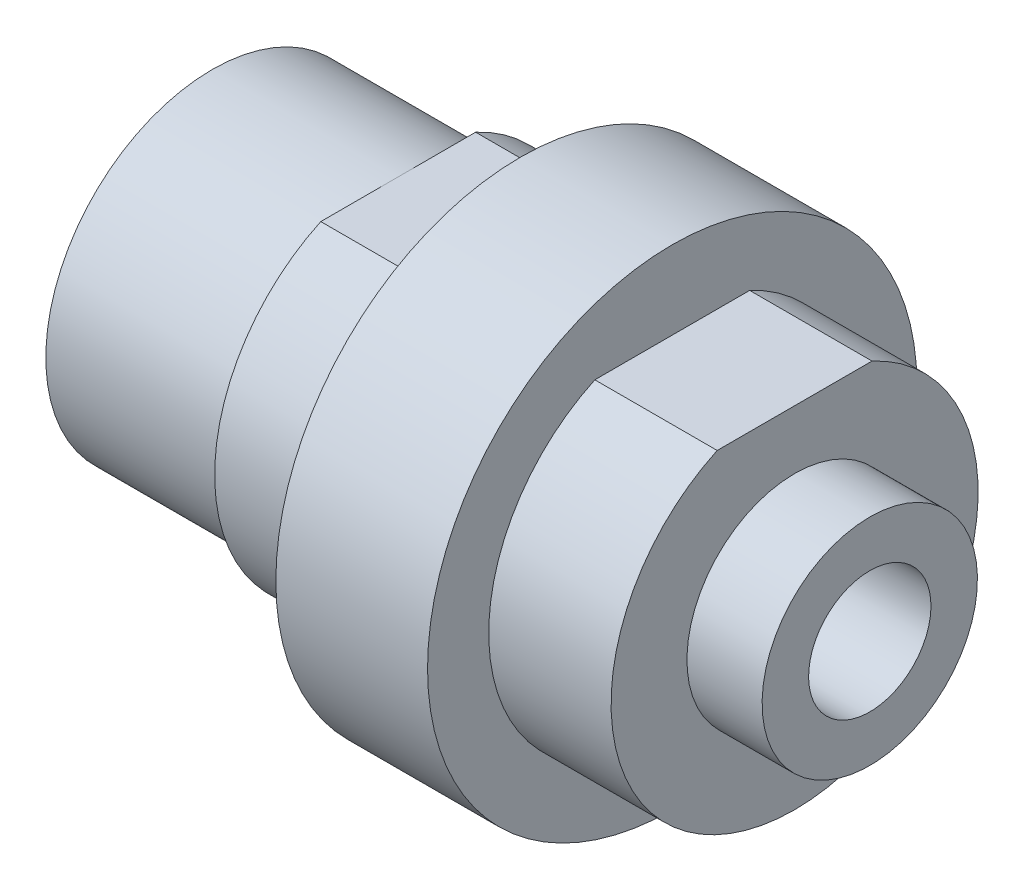
ISO-10303-21;
HEADER;
FILE_DESCRIPTION(('STEP AP214'),'2;1');
FILE_NAME('part.step','',(''),(''),'','','');
FILE_SCHEMA(('AUTOMOTIVE_DESIGN { 1 0 10303 214 1 1 1 1 }'));
ENDSEC;
DATA;
#1=APPLICATION_CONTEXT('core data for automotive mechanical design processes');
#2=APPLICATION_PROTOCOL_DEFINITION('international standard','automotive_design',2000,#1);
#3=PRODUCT_CONTEXT('',#1,'mechanical');
#4=PRODUCT('Part','Part','',(#3));
#5=PRODUCT_RELATED_PRODUCT_CATEGORY('part','',(#4));
#6=PRODUCT_DEFINITION_FORMATION('','',#4);
#7=PRODUCT_DEFINITION_CONTEXT('part definition',#1,'design');
#8=PRODUCT_DEFINITION('design','',#6,#7);
#9=PRODUCT_DEFINITION_SHAPE('','',#8);
#10=(LENGTH_UNIT() NAMED_UNIT(*) SI_UNIT(.MILLI.,.METRE.));
#11=(NAMED_UNIT(*) PLANE_ANGLE_UNIT() SI_UNIT($,.RADIAN.));
#12=(NAMED_UNIT(*) SI_UNIT($,.STERADIAN.) SOLID_ANGLE_UNIT());
#13=UNCERTAINTY_MEASURE_WITH_UNIT(LENGTH_MEASURE(1.E-05),#10,'distance_accuracy_value','');
#14=(GEOMETRIC_REPRESENTATION_CONTEXT(3) GLOBAL_UNCERTAINTY_ASSIGNED_CONTEXT((#13)) GLOBAL_UNIT_ASSIGNED_CONTEXT((#10,
#11,#12)) REPRESENTATION_CONTEXT('',''));
#15=CARTESIAN_POINT('',(0.,0.,0.));
#16=DIRECTION('',(0.,0.,1.));
#17=DIRECTION('',(1.,0.,0.));
#18=AXIS2_PLACEMENT_3D('',#15,#16,#17);
#19=CARTESIAN_POINT('',(34.12744,0.,0.));
#20=DIRECTION('',(1.,0.,0.));
#21=DIRECTION('',(0.,1.,0.));
#22=AXIS2_PLACEMENT_3D('',#19,#20,#21);
#23=CYLINDRICAL_SURFACE('',#22,3.175);
#24=CARTESIAN_POINT('',(0.,0.,0.));
#25=DIRECTION('',(1.,0.,0.));
#26=DIRECTION('',(0.,1.,0.));
#27=AXIS2_PLACEMENT_3D('',#24,#25,#26);
#28=CIRCLE('',#27,3.175);
#29=CARTESIAN_POINT('',(0.,3.175,0.));
#30=VERTEX_POINT('',#29);
#31=EDGE_CURVE('E126',#30,#30,#28,.T.);
#32=ORIENTED_EDGE('',*,*,#31,.F.);
#33=EDGE_LOOP('',(#32));
#34=FACE_BOUND('',#33,.T.);
#35=CARTESIAN_POINT('',(34.12744,0.,0.));
#36=DIRECTION('',(1.,0.,0.));
#37=DIRECTION('',(0.,1.,0.));
#38=AXIS2_PLACEMENT_3D('',#35,#36,#37);
#39=CIRCLE('',#38,3.175);
#40=CARTESIAN_POINT('',(34.12744,3.175,0.));
#41=VERTEX_POINT('',#40);
#42=EDGE_CURVE('E11',#41,#41,#39,.T.);
#43=ORIENTED_EDGE('',*,*,#42,.T.);
#44=EDGE_LOOP('',(#43));
#45=FACE_BOUND('',#44,.T.);
#46=ADVANCED_FACE('F47',(#34,#45),#23,.F.);
#47=CARTESIAN_POINT('',(34.12744,0.,0.));
#48=DIRECTION('',(-1.,0.,0.));
#49=DIRECTION('',(0.,-1.,0.));
#50=AXIS2_PLACEMENT_3D('',#47,#48,#49);
#51=PLANE('',#50);
#52=ORIENTED_EDGE('',*,*,#42,.F.);
#53=EDGE_LOOP('',(#52));
#54=FACE_BOUND('',#53,.T.);
#55=CARTESIAN_POINT('',(34.12744,0.,0.));
#56=DIRECTION('',(1.,0.,0.));
#57=DIRECTION('',(0.,1.,0.));
#58=AXIS2_PLACEMENT_3D('',#55,#56,#57);
#59=CIRCLE('',#58,5.58800000000001);
#60=CARTESIAN_POINT('',(34.12744,5.58800000000001,0.));
#61=VERTEX_POINT('',#60);
#62=EDGE_CURVE('E55',#61,#61,#59,.T.);
#63=ORIENTED_EDGE('',*,*,#62,.T.);
#64=EDGE_LOOP('',(#63));
#65=FACE_BOUND('',#64,.T.);
#66=ADVANCED_FACE('F165',(#54,#65),#51,.F.);
#67=CARTESIAN_POINT('',(34.12744,0.,0.));
#68=DIRECTION('',(1.,0.,0.));
#69=DIRECTION('',(0.,1.,0.));
#70=AXIS2_PLACEMENT_3D('',#67,#68,#69);
#71=CYLINDRICAL_SURFACE('',#70,5.58800000000001);
#72=ORIENTED_EDGE('',*,*,#62,.F.);
#73=EDGE_LOOP('',(#72));
#74=FACE_BOUND('',#73,.T.);
#75=CARTESIAN_POINT('',(30.226,0.,0.));
#76=DIRECTION('',(1.,0.,0.));
#77=DIRECTION('',(0.,1.,0.));
#78=AXIS2_PLACEMENT_3D('',#75,#76,#77);
#79=CIRCLE('',#78,5.58800000000001);
#80=CARTESIAN_POINT('',(30.226,5.58800000000001,0.));
#81=VERTEX_POINT('',#80);
#82=EDGE_CURVE('E158',#81,#81,#79,.T.);
#83=ORIENTED_EDGE('',*,*,#82,.T.);
#84=EDGE_LOOP('',(#83));
#85=FACE_BOUND('',#84,.T.);
#86=ADVANCED_FACE('F167',(#74,#85),#71,.T.);
#87=CARTESIAN_POINT('',(30.226,0.,0.));
#88=DIRECTION('',(-1.,0.,0.));
#89=DIRECTION('',(0.,-1.,0.));
#90=AXIS2_PLACEMENT_3D('',#87,#88,#89);
#91=PLANE('',#90);
#92=ORIENTED_EDGE('',*,*,#82,.F.);
#93=EDGE_LOOP('',(#92));
#94=FACE_BOUND('',#93,.T.);
#95=CARTESIAN_POINT('',(30.226,0.,0.));
#96=DIRECTION('',(1.,0.,0.));
#97=DIRECTION('',(0.,1.,0.));
#98=AXIS2_PLACEMENT_3D('',#95,#96,#97);
#99=CIRCLE('',#98,9.525);
#100=CARTESIAN_POINT('',(30.226,8.636,4.01810017296732));
#101=VERTEX_POINT('',#100);
#102=CARTESIAN_POINT('',(30.226,8.636,-4.01810017296732));
#103=VERTEX_POINT('',#102);
#104=EDGE_CURVE('E154',#101,#103,#99,.T.);
#105=ORIENTED_EDGE('',*,*,#104,.T.);
#106=DIRECTION('',(0.,0.,1.));
#107=VECTOR('',#106,1.);
#108=CARTESIAN_POINT('',(30.226,8.636,-12.7));
#109=LINE('',#108,#107);
#110=EDGE_CURVE('E106',#103,#101,#109,.T.);
#111=ORIENTED_EDGE('',*,*,#110,.T.);
#112=EDGE_LOOP('',(#105,#111));
#113=FACE_BOUND('',#112,.T.);
#114=ADVANCED_FACE('F170',(#94,#113),#91,.F.);
#115=CARTESIAN_POINT('',(34.12744,0.,0.));
#116=DIRECTION('',(1.,0.,0.));
#117=DIRECTION('',(0.,1.,0.));
#118=AXIS2_PLACEMENT_3D('',#115,#116,#117);
#119=CYLINDRICAL_SURFACE('',#118,9.525);
#120=CARTESIAN_POINT('',(23.876,0.,0.));
#121=DIRECTION('',(1.,0.,0.));
#122=DIRECTION('',(0.,1.,0.));
#123=AXIS2_PLACEMENT_3D('',#120,#121,#122);
#124=CIRCLE('',#123,9.525);
#125=CARTESIAN_POINT('',(23.876,8.636,4.01810017296732));
#126=VERTEX_POINT('',#125);
#127=CARTESIAN_POINT('',(23.876,8.636,-4.01810017296732));
#128=VERTEX_POINT('',#127);
#129=EDGE_CURVE('E150',#126,#128,#124,.T.);
#130=ORIENTED_EDGE('',*,*,#129,.T.);
#131=DIRECTION('',(1.,0.,0.));
#132=VECTOR('',#131,1.);
#133=CARTESIAN_POINT('',(34.12744,8.636,-4.01810017296732));
#134=LINE('',#133,#132);
#135=EDGE_CURVE('E122',#128,#103,#134,.T.);
#136=ORIENTED_EDGE('',*,*,#135,.T.);
#137=ORIENTED_EDGE('',*,*,#104,.F.);
#138=DIRECTION('',(1.,0.,0.));
#139=VECTOR('',#138,1.);
#140=CARTESIAN_POINT('',(34.12744,8.636,4.01810017296732));
#141=LINE('',#140,#139);
#142=EDGE_CURVE('E118',#101,#126,#141,.F.);
#143=ORIENTED_EDGE('',*,*,#142,.T.);
#144=EDGE_LOOP('',(#130,#136,#137,#143));
#145=FACE_BOUND('',#144,.T.);
#146=ADVANCED_FACE('F176',(#145),#119,.T.);
#147=CARTESIAN_POINT('',(23.876,0.,0.));
#148=DIRECTION('',(-1.,0.,0.));
#149=DIRECTION('',(0.,-1.,0.));
#150=AXIS2_PLACEMENT_3D('',#147,#148,#149);
#151=PLANE('',#150);
#152=ORIENTED_EDGE('',*,*,#129,.F.);
#153=DIRECTION('',(0.,0.,1.));
#154=VECTOR('',#153,1.);
#155=CARTESIAN_POINT('',(23.876,8.636,-12.7));
#156=LINE('',#155,#154);
#157=EDGE_CURVE('E61',#128,#126,#156,.T.);
#158=ORIENTED_EDGE('',*,*,#157,.F.);
#159=EDGE_LOOP('',(#152,#158));
#160=FACE_BOUND('',#159,.T.);
#161=CARTESIAN_POINT('',(23.876,0.,0.));
#162=DIRECTION('',(1.,0.,0.));
#163=DIRECTION('',(0.,1.,0.));
#164=AXIS2_PLACEMENT_3D('',#161,#162,#163);
#165=CIRCLE('',#164,12.7);
#166=CARTESIAN_POINT('',(23.876,12.7,0.));
#167=VERTEX_POINT('',#166);
#168=EDGE_CURVE('E146',#167,#167,#165,.T.);
#169=ORIENTED_EDGE('',*,*,#168,.T.);
#170=EDGE_LOOP('',(#169));
#171=FACE_BOUND('',#170,.T.);
#172=ADVANCED_FACE('F223',(#160,#171),#151,.F.);
#173=CARTESIAN_POINT('',(34.12744,0.,0.));
#174=DIRECTION('',(1.,0.,0.));
#175=DIRECTION('',(0.,1.,0.));
#176=AXIS2_PLACEMENT_3D('',#173,#174,#175);
#177=CYLINDRICAL_SURFACE('',#176,12.7);
#178=ORIENTED_EDGE('',*,*,#168,.F.);
#179=EDGE_LOOP('',(#178));
#180=FACE_BOUND('',#179,.T.);
#181=CARTESIAN_POINT('',(16.002,0.,0.));
#182=DIRECTION('',(1.,0.,0.));
#183=DIRECTION('',(0.,1.,0.));
#184=AXIS2_PLACEMENT_3D('',#181,#182,#183);
#185=CIRCLE('',#184,12.7);
#186=CARTESIAN_POINT('',(16.002,12.7,0.));
#187=VERTEX_POINT('',#186);
#188=EDGE_CURVE('E142',#187,#187,#185,.T.);
#189=ORIENTED_EDGE('',*,*,#188,.T.);
#190=EDGE_LOOP('',(#189));
#191=FACE_BOUND('',#190,.T.);
#192=ADVANCED_FACE('F219',(#180,#191),#177,.T.);
#193=CARTESIAN_POINT('',(16.002,0.,0.));
#194=DIRECTION('',(1.,0.,0.));
#195=DIRECTION('',(0.,1.,0.));
#196=AXIS2_PLACEMENT_3D('',#193,#194,#195);
#197=PLANE('',#196);
#198=DIRECTION('',(0.,0.,1.));
#199=VECTOR('',#198,1.);
#200=CARTESIAN_POINT('',(16.002,8.636,-12.7));
#201=LINE('',#200,#199);
#202=CARTESIAN_POINT('',(16.002,8.636,-4.01810017296732));
#203=VERTEX_POINT('',#202);
#204=CARTESIAN_POINT('',(16.002,8.636,4.01810017296732));
#205=VERTEX_POINT('',#204);
#206=EDGE_CURVE('E98',#203,#205,#201,.T.);
#207=ORIENTED_EDGE('',*,*,#206,.T.);
#208=CARTESIAN_POINT('',(16.002,0.,0.));
#209=DIRECTION('',(1.,0.,0.));
#210=DIRECTION('',(0.,1.,0.));
#211=AXIS2_PLACEMENT_3D('',#208,#209,#210);
#212=CIRCLE('',#211,9.525);
#213=EDGE_CURVE('E138',#205,#203,#212,.T.);
#214=ORIENTED_EDGE('',*,*,#213,.T.);
#215=EDGE_LOOP('',(#207,#214));
#216=FACE_BOUND('',#215,.T.);
#217=ORIENTED_EDGE('',*,*,#188,.F.);
#218=EDGE_LOOP('',(#217));
#219=FACE_BOUND('',#218,.T.);
#220=ADVANCED_FACE('F215',(#216,#219),#197,.F.);
#221=CARTESIAN_POINT('',(34.12744,0.,0.));
#222=DIRECTION('',(1.,0.,0.));
#223=DIRECTION('',(0.,1.,0.));
#224=AXIS2_PLACEMENT_3D('',#221,#222,#223);
#225=CYLINDRICAL_SURFACE('',#224,9.525);
#226=CARTESIAN_POINT('',(9.65199999999999,0.,0.));
#227=DIRECTION('',(1.,0.,0.));
#228=DIRECTION('',(0.,1.,0.));
#229=AXIS2_PLACEMENT_3D('',#226,#227,#228);
#230=CIRCLE('',#229,9.525);
#231=CARTESIAN_POINT('',(9.65199999999999,8.636,4.01810017296732));
#232=VERTEX_POINT('',#231);
#233=CARTESIAN_POINT('',(9.65199999999999,8.636,-4.01810017296732));
#234=VERTEX_POINT('',#233);
#235=EDGE_CURVE('E103',#232,#234,#230,.T.);
#236=ORIENTED_EDGE('',*,*,#235,.T.);
#237=DIRECTION('',(1.,0.,0.));
#238=VECTOR('',#237,1.);
#239=CARTESIAN_POINT('',(34.12744,8.636,-4.01810017296732));
#240=LINE('',#239,#238);
#241=EDGE_CURVE('E69',#234,#203,#240,.T.);
#242=ORIENTED_EDGE('',*,*,#241,.T.);
#243=ORIENTED_EDGE('',*,*,#213,.F.);
#244=DIRECTION('',(1.,0.,0.));
#245=VECTOR('',#244,1.);
#246=CARTESIAN_POINT('',(34.12744,8.636,4.01810017296732));
#247=LINE('',#246,#245);
#248=EDGE_CURVE('E113',#205,#232,#247,.F.);
#249=ORIENTED_EDGE('',*,*,#248,.T.);
#250=EDGE_LOOP('',(#236,#242,#243,#249));
#251=FACE_BOUND('',#250,.T.);
#252=ADVANCED_FACE('F212',(#251),#225,.T.);
#253=CARTESIAN_POINT('',(9.65199999999999,0.,0.));
#254=DIRECTION('',(1.,0.,0.));
#255=DIRECTION('',(0.,1.,0.));
#256=AXIS2_PLACEMENT_3D('',#253,#254,#255);
#257=PLANE('',#256);
#258=ORIENTED_EDGE('',*,*,#235,.F.);
#259=DIRECTION('',(0.,0.,1.));
#260=VECTOR('',#259,1.);
#261=CARTESIAN_POINT('',(9.65199999999999,8.636,-12.7));
#262=LINE('',#261,#260);
#263=CARTESIAN_POINT('',(9.65199999999999,8.636,0.));
#264=VERTEX_POINT('',#263);
#265=EDGE_CURVE('E91',#264,#232,#262,.T.);
#266=ORIENTED_EDGE('',*,*,#265,.F.);
#267=CARTESIAN_POINT('',(9.65199999999999,0.,0.));
#268=DIRECTION('',(1.,0.,0.));
#269=DIRECTION('',(0.,1.,0.));
#270=AXIS2_PLACEMENT_3D('',#267,#268,#269);
#271=CIRCLE('',#270,8.636);
#272=EDGE_CURVE('E102',#264,#264,#271,.T.);
#273=ORIENTED_EDGE('',*,*,#272,.T.);
#274=EDGE_CURVE('E88',#234,#264,#262,.T.);
#275=ORIENTED_EDGE('',*,*,#274,.F.);
#276=EDGE_LOOP('',(#258,#266,#273,#275));
#277=FACE_BOUND('',#276,.T.);
#278=ADVANCED_FACE('F100',(#277),#257,.F.);
#279=CARTESIAN_POINT('',(34.12744,0.,0.));
#280=DIRECTION('',(1.,0.,0.));
#281=DIRECTION('',(0.,1.,0.));
#282=AXIS2_PLACEMENT_3D('',#279,#280,#281);
#283=CYLINDRICAL_SURFACE('',#282,8.636);
#284=ORIENTED_EDGE('',*,*,#272,.F.);
#285=EDGE_LOOP('',(#284));
#286=FACE_BOUND('',#285,.T.);
#287=CARTESIAN_POINT('',(0.,0.,0.));
#288=DIRECTION('',(1.,0.,0.));
#289=DIRECTION('',(0.,1.,0.));
#290=AXIS2_PLACEMENT_3D('',#287,#288,#289);
#291=CIRCLE('',#290,8.636);
#292=CARTESIAN_POINT('',(0.,8.636,0.));
#293=VERTEX_POINT('',#292);
#294=EDGE_CURVE('E130',#293,#293,#291,.T.);
#295=ORIENTED_EDGE('',*,*,#294,.T.);
#296=EDGE_LOOP('',(#295));
#297=FACE_BOUND('',#296,.T.);
#298=ADVANCED_FACE('F201',(#286,#297),#283,.T.);
#299=CARTESIAN_POINT('',(0.,0.,0.));
#300=DIRECTION('',(1.,0.,0.));
#301=DIRECTION('',(0.,1.,0.));
#302=AXIS2_PLACEMENT_3D('',#299,#300,#301);
#303=PLANE('',#302);
#304=ORIENTED_EDGE('',*,*,#294,.F.);
#305=EDGE_LOOP('',(#304));
#306=FACE_BOUND('',#305,.T.);
#307=ORIENTED_EDGE('',*,*,#31,.T.);
#308=EDGE_LOOP('',(#307));
#309=FACE_BOUND('',#308,.T.);
#310=ADVANCED_FACE('F187',(#306,#309),#303,.F.);
#311=CARTESIAN_POINT('',(9.65199999999999,8.636,-12.7));
#312=DIRECTION('',(0.,-1.,0.));
#313=DIRECTION('',(0.,0.,-1.));
#314=AXIS2_PLACEMENT_3D('',#311,#312,#313);
#315=PLANE('',#314);
#316=ORIENTED_EDGE('',*,*,#274,.T.);
#317=ORIENTED_EDGE('',*,*,#265,.T.);
#318=ORIENTED_EDGE('',*,*,#248,.F.);
#319=ORIENTED_EDGE('',*,*,#206,.F.);
#320=ORIENTED_EDGE('',*,*,#241,.F.);
#321=EDGE_LOOP('',(#316,#317,#318,#319,#320));
#322=FACE_BOUND('',#321,.T.);
#323=ADVANCED_FACE('F90',(#322),#315,.F.);
#324=CARTESIAN_POINT('',(23.876,8.636,-12.7));
#325=DIRECTION('',(0.,-1.,0.));
#326=DIRECTION('',(0.,0.,-1.));
#327=AXIS2_PLACEMENT_3D('',#324,#325,#326);
#328=PLANE('',#327);
#329=ORIENTED_EDGE('',*,*,#157,.T.);
#330=ORIENTED_EDGE('',*,*,#142,.F.);
#331=ORIENTED_EDGE('',*,*,#110,.F.);
#332=ORIENTED_EDGE('',*,*,#135,.F.);
#333=EDGE_LOOP('',(#329,#330,#331,#332));
#334=FACE_BOUND('',#333,.T.);
#335=ADVANCED_FACE('F181',(#334),#328,.F.);
#336=CLOSED_SHELL('',(#46,#66,#86,#114,#146,#172,#192,#220,#252,#278,#298,#310,#323,#335));
#337=MANIFOLD_SOLID_BREP('B2',#336);
#338=ADVANCED_BREP_SHAPE_REPRESENTATION('',(#18,#337),#14);
#339=SHAPE_DEFINITION_REPRESENTATION(#9,#338);
ENDSEC;
END-ISO-10303-21;
